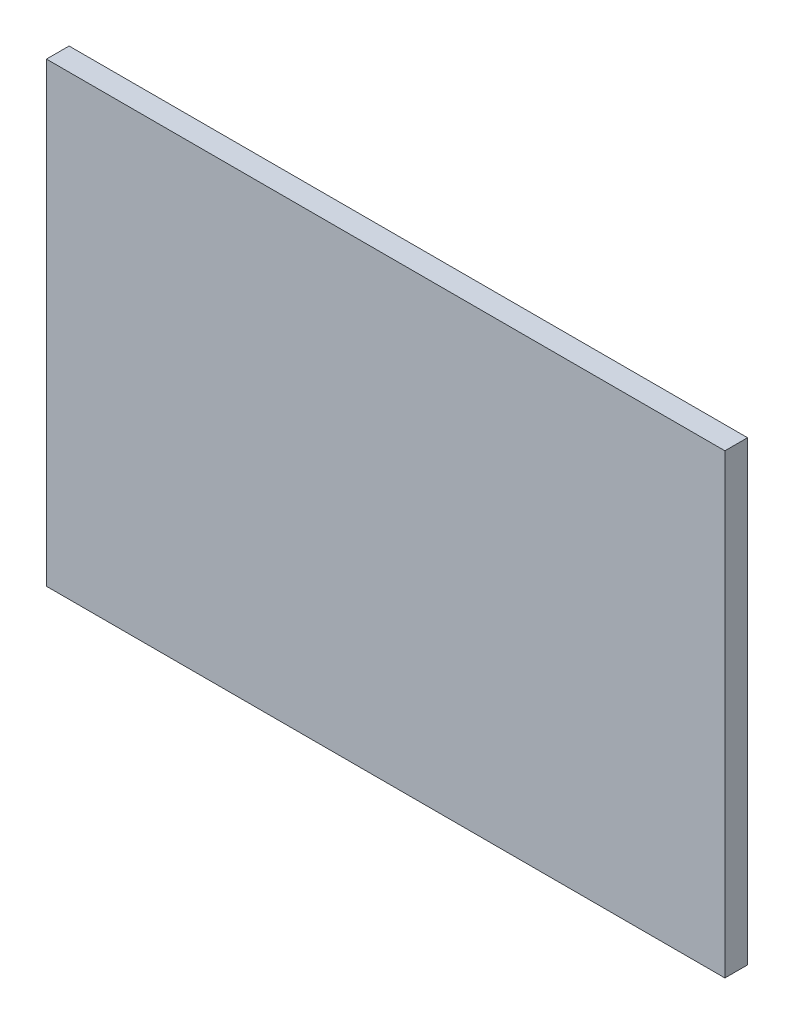
ISO-10303-21;
HEADER;
FILE_DESCRIPTION(('STEP AP214'),'2;1');
FILE_NAME('part.step','',(''),(''),'','','');
FILE_SCHEMA(('AUTOMOTIVE_DESIGN { 1 0 10303 214 1 1 1 1 }'));
ENDSEC;
DATA;
#1=APPLICATION_CONTEXT('core data for automotive mechanical design processes');
#2=APPLICATION_PROTOCOL_DEFINITION('international standard','automotive_design',2000,#1);
#3=PRODUCT_CONTEXT('',#1,'mechanical');
#4=PRODUCT('Part','Part','',(#3));
#5=PRODUCT_RELATED_PRODUCT_CATEGORY('part','',(#4));
#6=PRODUCT_DEFINITION_FORMATION('','',#4);
#7=PRODUCT_DEFINITION_CONTEXT('part definition',#1,'design');
#8=PRODUCT_DEFINITION('design','',#6,#7);
#9=PRODUCT_DEFINITION_SHAPE('','',#8);
#10=(LENGTH_UNIT() NAMED_UNIT(*) SI_UNIT(.MILLI.,.METRE.));
#11=(NAMED_UNIT(*) PLANE_ANGLE_UNIT() SI_UNIT($,.RADIAN.));
#12=(NAMED_UNIT(*) SI_UNIT($,.STERADIAN.) SOLID_ANGLE_UNIT());
#13=UNCERTAINTY_MEASURE_WITH_UNIT(LENGTH_MEASURE(1.E-05),#10,'distance_accuracy_value','');
#14=(GEOMETRIC_REPRESENTATION_CONTEXT(3) GLOBAL_UNCERTAINTY_ASSIGNED_CONTEXT((#13)) GLOBAL_UNIT_ASSIGNED_CONTEXT((#10,
#11,#12)) REPRESENTATION_CONTEXT('',''));
#15=CARTESIAN_POINT('',(0.,0.,0.));
#16=DIRECTION('',(0.,0.,1.));
#17=DIRECTION('',(1.,0.,0.));
#18=AXIS2_PLACEMENT_3D('',#15,#16,#17);
#19=CARTESIAN_POINT('',(1.5084,-1.0184,0.));
#20=DIRECTION('',(0.,0.,-1.));
#21=DIRECTION('',(-1.,0.,0.));
#22=AXIS2_PLACEMENT_3D('',#19,#20,#21);
#23=PLANE('',#22);
#24=DIRECTION('',(0.,-1.,0.));
#25=VECTOR('',#24,1.);
#26=CARTESIAN_POINT('',(-1.4984,0.,0.));
#27=LINE('',#26,#25);
#28=CARTESIAN_POINT('',(-1.4984,1.0084,0.));
#29=VERTEX_POINT('',#28);
#30=CARTESIAN_POINT('',(-1.4984,-1.0084,0.));
#31=VERTEX_POINT('',#30);
#32=EDGE_CURVE('E68',#29,#31,#27,.T.);
#33=ORIENTED_EDGE('',*,*,#32,.F.);
#34=DIRECTION('',(-1.,0.,0.));
#35=VECTOR('',#34,1.);
#36=CARTESIAN_POINT('',(0.,1.0084,0.));
#37=LINE('',#36,#35);
#38=CARTESIAN_POINT('',(1.4984,1.0084,0.));
#39=VERTEX_POINT('',#38);
#40=EDGE_CURVE('E55',#39,#29,#37,.T.);
#41=ORIENTED_EDGE('',*,*,#40,.F.);
#42=DIRECTION('',(0.,1.,0.));
#43=VECTOR('',#42,1.);
#44=CARTESIAN_POINT('',(1.4984,0.,0.));
#45=LINE('',#44,#43);
#46=CARTESIAN_POINT('',(1.4984,-1.0084,0.));
#47=VERTEX_POINT('',#46);
#48=EDGE_CURVE('E20',#47,#39,#45,.T.);
#49=ORIENTED_EDGE('',*,*,#48,.F.);
#50=DIRECTION('',(1.,0.,0.));
#51=VECTOR('',#50,1.);
#52=CARTESIAN_POINT('',(0.,-1.0084,0.));
#53=LINE('',#52,#51);
#54=EDGE_CURVE('E80',#31,#47,#53,.T.);
#55=ORIENTED_EDGE('',*,*,#54,.F.);
#56=EDGE_LOOP('',(#33,#41,#49,#55));
#57=FACE_BOUND('',#56,.T.);
#58=ADVANCED_FACE('F16',(#57),#23,.T.);
#59=CARTESIAN_POINT('',(1.4984,-1.0184,0.11));
#60=DIRECTION('',(1.,0.,0.));
#61=DIRECTION('',(0.,0.,-1.));
#62=AXIS2_PLACEMENT_3D('',#59,#60,#61);
#63=PLANE('',#62);
#64=DIRECTION('',(0.,0.,-1.));
#65=VECTOR('',#64,1.);
#66=CARTESIAN_POINT('',(1.4984,1.0084,0.05));
#67=LINE('',#66,#65);
#68=CARTESIAN_POINT('',(1.4984,1.0084,0.1));
#69=VERTEX_POINT('',#68);
#70=EDGE_CURVE('E61',#69,#39,#67,.T.);
#71=ORIENTED_EDGE('',*,*,#70,.F.);
#72=DIRECTION('',(0.,1.,0.));
#73=VECTOR('',#72,1.);
#74=CARTESIAN_POINT('',(1.4984,0.,0.1));
#75=LINE('',#74,#73);
#76=CARTESIAN_POINT('',(1.4984,-1.0084,0.1));
#77=VERTEX_POINT('',#76);
#78=EDGE_CURVE('E83',#77,#69,#75,.T.);
#79=ORIENTED_EDGE('',*,*,#78,.F.);
#80=DIRECTION('',(0.,0.,1.));
#81=VECTOR('',#80,1.);
#82=CARTESIAN_POINT('',(1.4984,-1.0084,0.05));
#83=LINE('',#82,#81);
#84=EDGE_CURVE('E64',#47,#77,#83,.T.);
#85=ORIENTED_EDGE('',*,*,#84,.F.);
#86=ORIENTED_EDGE('',*,*,#48,.T.);
#87=EDGE_LOOP('',(#71,#79,#85,#86));
#88=FACE_BOUND('',#87,.T.);
#89=ADVANCED_FACE('F60',(#88),#63,.T.);
#90=CARTESIAN_POINT('',(-1.5084,1.0084,-0.01));
#91=DIRECTION('',(0.,1.,0.));
#92=DIRECTION('',(0.,0.,1.));
#93=AXIS2_PLACEMENT_3D('',#90,#91,#92);
#94=PLANE('',#93);
#95=DIRECTION('',(0.,0.,-1.));
#96=VECTOR('',#95,1.);
#97=CARTESIAN_POINT('',(-1.4984,1.0084,0.05));
#98=LINE('',#97,#96);
#99=CARTESIAN_POINT('',(-1.4984,1.0084,0.1));
#100=VERTEX_POINT('',#99);
#101=EDGE_CURVE('E70',#100,#29,#98,.T.);
#102=ORIENTED_EDGE('',*,*,#101,.F.);
#103=DIRECTION('',(-1.,0.,0.));
#104=VECTOR('',#103,1.);
#105=CARTESIAN_POINT('',(0.,1.0084,0.1));
#106=LINE('',#105,#104);
#107=EDGE_CURVE('E74',#69,#100,#106,.T.);
#108=ORIENTED_EDGE('',*,*,#107,.F.);
#109=ORIENTED_EDGE('',*,*,#70,.T.);
#110=ORIENTED_EDGE('',*,*,#40,.T.);
#111=EDGE_LOOP('',(#102,#108,#109,#110));
#112=FACE_BOUND('',#111,.T.);
#113=ADVANCED_FACE('F72',(#112),#94,.T.);
#114=CARTESIAN_POINT('',(-1.4984,-1.0184,-0.01));
#115=DIRECTION('',(-1.,0.,0.));
#116=DIRECTION('',(0.,0.,1.));
#117=AXIS2_PLACEMENT_3D('',#114,#115,#116);
#118=PLANE('',#117);
#119=DIRECTION('',(0.,0.,-1.));
#120=VECTOR('',#119,1.);
#121=CARTESIAN_POINT('',(-1.4984,-1.0084,0.05));
#122=LINE('',#121,#120);
#123=CARTESIAN_POINT('',(-1.4984,-1.0084,0.1));
#124=VERTEX_POINT('',#123);
#125=EDGE_CURVE('E35',#124,#31,#122,.T.);
#126=ORIENTED_EDGE('',*,*,#125,.F.);
#127=DIRECTION('',(0.,-1.,0.));
#128=VECTOR('',#127,1.);
#129=CARTESIAN_POINT('',(-1.4984,0.,0.1));
#130=LINE('',#129,#128);
#131=EDGE_CURVE('E26',#100,#124,#130,.T.);
#132=ORIENTED_EDGE('',*,*,#131,.F.);
#133=ORIENTED_EDGE('',*,*,#101,.T.);
#134=ORIENTED_EDGE('',*,*,#32,.T.);
#135=EDGE_LOOP('',(#126,#132,#133,#134));
#136=FACE_BOUND('',#135,.T.);
#137=ADVANCED_FACE('F88',(#136),#118,.T.);
#138=CARTESIAN_POINT('',(-1.5084,-1.0084,0.11));
#139=DIRECTION('',(0.,-1.,0.));
#140=DIRECTION('',(0.,0.,-1.));
#141=AXIS2_PLACEMENT_3D('',#138,#139,#140);
#142=PLANE('',#141);
#143=ORIENTED_EDGE('',*,*,#84,.T.);
#144=DIRECTION('',(1.,0.,0.));
#145=VECTOR('',#144,1.);
#146=CARTESIAN_POINT('',(0.,-1.0084,0.1));
#147=LINE('',#146,#145);
#148=EDGE_CURVE('E11',#124,#77,#147,.T.);
#149=ORIENTED_EDGE('',*,*,#148,.F.);
#150=ORIENTED_EDGE('',*,*,#125,.T.);
#151=ORIENTED_EDGE('',*,*,#54,.T.);
#152=EDGE_LOOP('',(#143,#149,#150,#151));
#153=FACE_BOUND('',#152,.T.);
#154=ADVANCED_FACE('F90',(#153),#142,.T.);
#155=CARTESIAN_POINT('',(-1.5084,-1.0184,0.1));
#156=DIRECTION('',(0.,0.,1.));
#157=DIRECTION('',(1.,0.,0.));
#158=AXIS2_PLACEMENT_3D('',#155,#156,#157);
#159=PLANE('',#158);
#160=ORIENTED_EDGE('',*,*,#131,.T.);
#161=ORIENTED_EDGE('',*,*,#148,.T.);
#162=ORIENTED_EDGE('',*,*,#78,.T.);
#163=ORIENTED_EDGE('',*,*,#107,.T.);
#164=EDGE_LOOP('',(#160,#161,#162,#163));
#165=FACE_BOUND('',#164,.T.);
#166=ADVANCED_FACE('F18',(#165),#159,.T.);
#167=CLOSED_SHELL('',(#58,#89,#113,#137,#154,#166));
#168=MANIFOLD_SOLID_BREP('B1',#167);
#169=ADVANCED_BREP_SHAPE_REPRESENTATION('',(#18,#168),#14);
#170=SHAPE_DEFINITION_REPRESENTATION(#9,#169);
ENDSEC;
END-ISO-10303-21;
